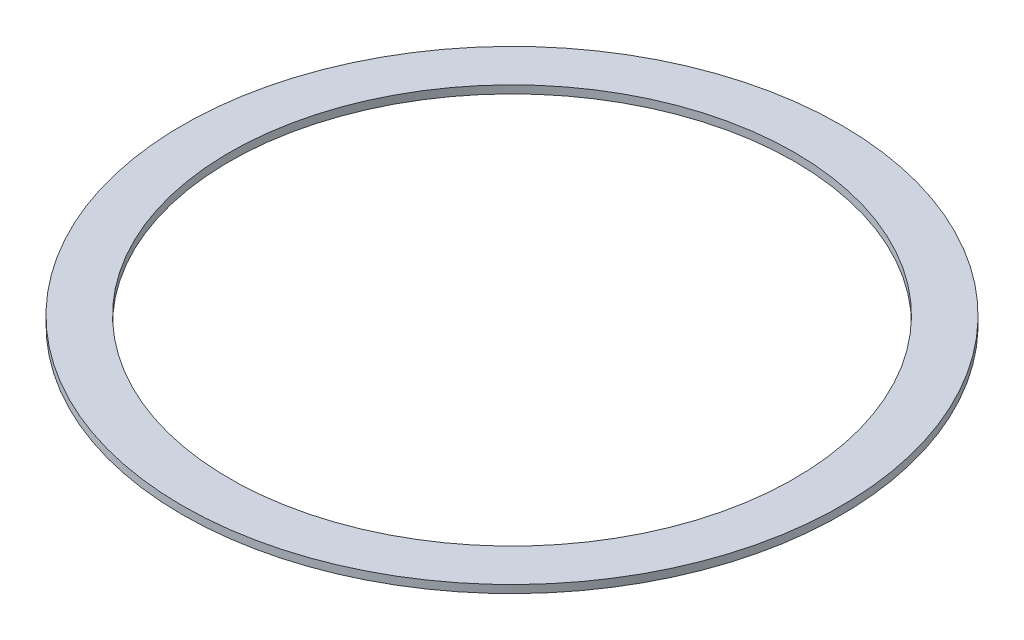
ISO-10303-21;
HEADER;
FILE_DESCRIPTION(('STEP AP214'),'2;1');
FILE_NAME('part.step','',(''),(''),'','','');
FILE_SCHEMA(('AUTOMOTIVE_DESIGN { 1 0 10303 214 1 1 1 1 }'));
ENDSEC;
DATA;
#1=APPLICATION_CONTEXT('core data for automotive mechanical design processes');
#2=APPLICATION_PROTOCOL_DEFINITION('international standard','automotive_design',2000,#1);
#3=PRODUCT_CONTEXT('',#1,'mechanical');
#4=PRODUCT('Part','Part','',(#3));
#5=PRODUCT_RELATED_PRODUCT_CATEGORY('part','',(#4));
#6=PRODUCT_DEFINITION_FORMATION('','',#4);
#7=PRODUCT_DEFINITION_CONTEXT('part definition',#1,'design');
#8=PRODUCT_DEFINITION('design','',#6,#7);
#9=PRODUCT_DEFINITION_SHAPE('','',#8);
#10=(LENGTH_UNIT() NAMED_UNIT(*) SI_UNIT(.MILLI.,.METRE.));
#11=(NAMED_UNIT(*) PLANE_ANGLE_UNIT() SI_UNIT($,.RADIAN.));
#12=(NAMED_UNIT(*) SI_UNIT($,.STERADIAN.) SOLID_ANGLE_UNIT());
#13=UNCERTAINTY_MEASURE_WITH_UNIT(LENGTH_MEASURE(1.E-05),#10,'distance_accuracy_value','');
#14=(GEOMETRIC_REPRESENTATION_CONTEXT(3) GLOBAL_UNCERTAINTY_ASSIGNED_CONTEXT((#13)) GLOBAL_UNIT_ASSIGNED_CONTEXT((#10,
#11,#12)) REPRESENTATION_CONTEXT('',''));
#15=CARTESIAN_POINT('',(0.,0.,0.));
#16=DIRECTION('',(0.,0.,1.));
#17=DIRECTION('',(1.,0.,0.));
#18=AXIS2_PLACEMENT_3D('',#15,#16,#17);
#19=CARTESIAN_POINT('',(-28.6263697350968,-36.039784006988,0.));
#20=DIRECTION('',(0.,-1.,0.));
#21=DIRECTION('',(0.,0.,-1.));
#22=AXIS2_PLACEMENT_3D('',#19,#20,#21);
#23=CYLINDRICAL_SURFACE('',#22,52.5);
#24=CARTESIAN_POINT('',(-28.6263697350968,-2.39847196120126,0.));
#25=DIRECTION('',(0.,-1.,0.));
#26=DIRECTION('',(0.,0.,-1.));
#27=AXIS2_PLACEMENT_3D('',#24,#25,#26);
#28=CIRCLE('',#27,52.5);
#29=CARTESIAN_POINT('',(-28.6263697350968,-2.39847196120126,-52.5));
#30=VERTEX_POINT('',#29);
#31=EDGE_CURVE('E10',#30,#30,#28,.T.);
#32=ORIENTED_EDGE('',*,*,#31,.T.);
#33=EDGE_LOOP('',(#32));
#34=FACE_BOUND('',#33,.T.);
#35=CARTESIAN_POINT('',(-28.6263697350968,-3.64847196120126,0.));
#36=DIRECTION('',(0.,-1.,0.));
#37=DIRECTION('',(0.,0.,-1.));
#38=AXIS2_PLACEMENT_3D('',#35,#36,#37);
#39=CIRCLE('',#38,52.5);
#40=CARTESIAN_POINT('',(-28.6263697350968,-3.64847196120126,-52.5));
#41=VERTEX_POINT('',#40);
#42=EDGE_CURVE('E45',#41,#41,#39,.T.);
#43=ORIENTED_EDGE('',*,*,#42,.F.);
#44=EDGE_LOOP('',(#43));
#45=FACE_BOUND('',#44,.T.);
#46=ADVANCED_FACE('F31',(#34,#45),#23,.T.);
#47=CARTESIAN_POINT('',(16.3736302649032,-2.39847196120126,0.));
#48=DIRECTION('',(0.,1.,0.));
#49=DIRECTION('',(0.,0.,1.));
#50=AXIS2_PLACEMENT_3D('',#47,#48,#49);
#51=PLANE('',#50);
#52=CARTESIAN_POINT('',(-28.6263697350968,-2.39847196120126,0.));
#53=DIRECTION('',(0.,-1.,0.));
#54=DIRECTION('',(0.,0.,-1.));
#55=AXIS2_PLACEMENT_3D('',#52,#53,#54);
#56=CIRCLE('',#55,45.);
#57=CARTESIAN_POINT('',(-28.6263697350968,-2.39847196120126,-45.));
#58=VERTEX_POINT('',#57);
#59=EDGE_CURVE('E37',#58,#58,#56,.T.);
#60=ORIENTED_EDGE('',*,*,#59,.T.);
#61=EDGE_LOOP('',(#60));
#62=FACE_BOUND('',#61,.T.);
#63=ORIENTED_EDGE('',*,*,#31,.F.);
#64=EDGE_LOOP('',(#63));
#65=FACE_BOUND('',#64,.T.);
#66=ADVANCED_FACE('F55',(#62,#65),#51,.T.);
#67=CARTESIAN_POINT('',(-28.6263697350968,-36.039784006988,0.));
#68=DIRECTION('',(0.,-1.,0.));
#69=DIRECTION('',(0.,0.,-1.));
#70=AXIS2_PLACEMENT_3D('',#67,#68,#69);
#71=CYLINDRICAL_SURFACE('',#70,45.);
#72=CARTESIAN_POINT('',(-28.6263697350968,-3.64847196120126,0.));
#73=DIRECTION('',(0.,-1.,0.));
#74=DIRECTION('',(0.,0.,-1.));
#75=AXIS2_PLACEMENT_3D('',#72,#73,#74);
#76=CIRCLE('',#75,45.);
#77=CARTESIAN_POINT('',(-28.6263697350968,-3.64847196120126,-45.));
#78=VERTEX_POINT('',#77);
#79=EDGE_CURVE('E41',#78,#78,#76,.T.);
#80=ORIENTED_EDGE('',*,*,#79,.T.);
#81=EDGE_LOOP('',(#80));
#82=FACE_BOUND('',#81,.T.);
#83=ORIENTED_EDGE('',*,*,#59,.F.);
#84=EDGE_LOOP('',(#83));
#85=FACE_BOUND('',#84,.T.);
#86=ADVANCED_FACE('F59',(#82,#85),#71,.F.);
#87=CARTESIAN_POINT('',(16.3736302649032,-3.64847196120126,0.));
#88=DIRECTION('',(0.,-1.,0.));
#89=DIRECTION('',(0.,0.,-1.));
#90=AXIS2_PLACEMENT_3D('',#87,#88,#89);
#91=PLANE('',#90);
#92=ORIENTED_EDGE('',*,*,#42,.T.);
#93=EDGE_LOOP('',(#92));
#94=FACE_BOUND('',#93,.T.);
#95=ORIENTED_EDGE('',*,*,#79,.F.);
#96=EDGE_LOOP('',(#95));
#97=FACE_BOUND('',#96,.T.);
#98=ADVANCED_FACE('F51',(#94,#97),#91,.T.);
#99=CLOSED_SHELL('',(#46,#66,#86,#98));
#100=MANIFOLD_SOLID_BREP('B2',#99);
#101=ADVANCED_BREP_SHAPE_REPRESENTATION('',(#18,#100),#14);
#102=SHAPE_DEFINITION_REPRESENTATION(#9,#101);
ENDSEC;
END-ISO-10303-21;
